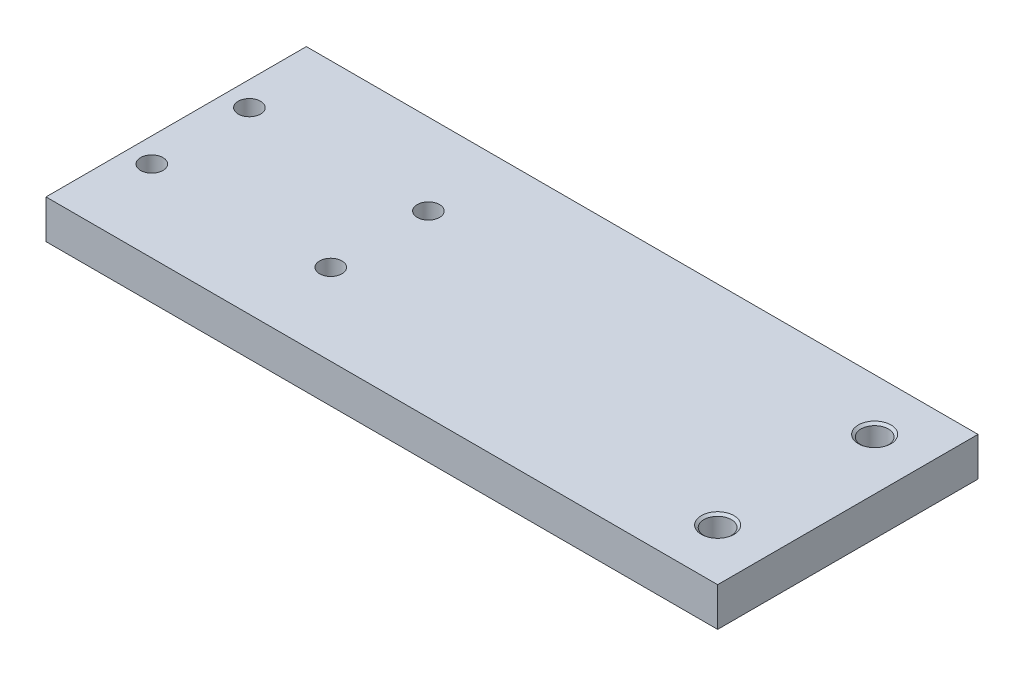
ISO-10303-21;
HEADER;
FILE_DESCRIPTION(('STEP AP214'),'2;1');
FILE_NAME('part.step','',(''),(''),'','','');
FILE_SCHEMA(('AUTOMOTIVE_DESIGN { 1 0 10303 214 1 1 1 1 }'));
ENDSEC;
DATA;
#1=APPLICATION_CONTEXT('core data for automotive mechanical design processes');
#2=APPLICATION_PROTOCOL_DEFINITION('international standard','automotive_design',2000,#1);
#3=PRODUCT_CONTEXT('',#1,'mechanical');
#4=PRODUCT('Part','Part','',(#3));
#5=PRODUCT_RELATED_PRODUCT_CATEGORY('part','',(#4));
#6=PRODUCT_DEFINITION_FORMATION('','',#4);
#7=PRODUCT_DEFINITION_CONTEXT('part definition',#1,'design');
#8=PRODUCT_DEFINITION('design','',#6,#7);
#9=PRODUCT_DEFINITION_SHAPE('','',#8);
#10=(LENGTH_UNIT() NAMED_UNIT(*) SI_UNIT(.MILLI.,.METRE.));
#11=(NAMED_UNIT(*) PLANE_ANGLE_UNIT() SI_UNIT($,.RADIAN.));
#12=(NAMED_UNIT(*) SI_UNIT($,.STERADIAN.) SOLID_ANGLE_UNIT());
#13=UNCERTAINTY_MEASURE_WITH_UNIT(LENGTH_MEASURE(1.E-05),#10,'distance_accuracy_value','');
#14=(GEOMETRIC_REPRESENTATION_CONTEXT(3) GLOBAL_UNCERTAINTY_ASSIGNED_CONTEXT((#13)) GLOBAL_UNIT_ASSIGNED_CONTEXT((#10,
#11,#12)) REPRESENTATION_CONTEXT('',''));
#15=CARTESIAN_POINT('',(0.,0.,0.));
#16=DIRECTION('',(0.,0.,1.));
#17=DIRECTION('',(1.,0.,0.));
#18=AXIS2_PLACEMENT_3D('',#15,#16,#17);
#19=CARTESIAN_POINT('',(0.,9.525,0.));
#20=DIRECTION('',(1.,0.,0.));
#21=DIRECTION('',(0.,0.,-1.));
#22=AXIS2_PLACEMENT_3D('',#19,#20,#21);
#23=PLANE('',#22);
#24=DIRECTION('',(0.,0.,1.));
#25=VECTOR('',#24,1.);
#26=CARTESIAN_POINT('',(0.,0.,0.));
#27=LINE('',#26,#25);
#28=CARTESIAN_POINT('',(0.,0.,-64.));
#29=VERTEX_POINT('',#28);
#30=CARTESIAN_POINT('',(0.,0.,0.));
#31=VERTEX_POINT('',#30);
#32=EDGE_CURVE('E111',#29,#31,#27,.T.);
#33=ORIENTED_EDGE('',*,*,#32,.T.);
#34=DIRECTION('',(0.,-1.,0.));
#35=VECTOR('',#34,1.);
#36=CARTESIAN_POINT('',(0.,9.525,0.));
#37=LINE('',#36,#35);
#38=CARTESIAN_POINT('',(0.,9.525,0.));
#39=VERTEX_POINT('',#38);
#40=EDGE_CURVE('E11',#39,#31,#37,.T.);
#41=ORIENTED_EDGE('',*,*,#40,.F.);
#42=DIRECTION('',(0.,0.,1.));
#43=VECTOR('',#42,1.);
#44=CARTESIAN_POINT('',(0.,9.525,0.));
#45=LINE('',#44,#43);
#46=CARTESIAN_POINT('',(0.,9.525,-64.));
#47=VERTEX_POINT('',#46);
#48=EDGE_CURVE('E95',#47,#39,#45,.T.);
#49=ORIENTED_EDGE('',*,*,#48,.F.);
#50=DIRECTION('',(0.,-1.,0.));
#51=VECTOR('',#50,1.);
#52=CARTESIAN_POINT('',(0.,9.525,-64.));
#53=LINE('',#52,#51);
#54=EDGE_CURVE('E107',#47,#29,#53,.T.);
#55=ORIENTED_EDGE('',*,*,#54,.T.);
#56=EDGE_LOOP('',(#33,#41,#49,#55));
#57=FACE_BOUND('',#56,.T.);
#58=ADVANCED_FACE('F43',(#57),#23,.F.);
#59=CARTESIAN_POINT('',(0.,9.525,0.));
#60=DIRECTION('',(0.,0.,-1.));
#61=DIRECTION('',(-1.,0.,0.));
#62=AXIS2_PLACEMENT_3D('',#59,#60,#61);
#63=PLANE('',#62);
#64=DIRECTION('',(1.,0.,0.));
#65=VECTOR('',#64,1.);
#66=CARTESIAN_POINT('',(0.,0.,0.));
#67=LINE('',#66,#65);
#68=CARTESIAN_POINT('',(165.1,0.,0.));
#69=VERTEX_POINT('',#68);
#70=EDGE_CURVE('E100',#31,#69,#67,.T.);
#71=ORIENTED_EDGE('',*,*,#70,.T.);
#72=DIRECTION('',(0.,-1.,0.));
#73=VECTOR('',#72,1.);
#74=CARTESIAN_POINT('',(165.1,9.525,0.));
#75=LINE('',#74,#73);
#76=CARTESIAN_POINT('',(165.1,9.525,0.));
#77=VERTEX_POINT('',#76);
#78=EDGE_CURVE('E52',#77,#69,#75,.T.);
#79=ORIENTED_EDGE('',*,*,#78,.F.);
#80=DIRECTION('',(1.,0.,0.));
#81=VECTOR('',#80,1.);
#82=CARTESIAN_POINT('',(0.,9.525,0.));
#83=LINE('',#82,#81);
#84=EDGE_CURVE('E90',#39,#77,#83,.T.);
#85=ORIENTED_EDGE('',*,*,#84,.F.);
#86=ORIENTED_EDGE('',*,*,#40,.T.);
#87=EDGE_LOOP('',(#71,#79,#85,#86));
#88=FACE_BOUND('',#87,.T.);
#89=ADVANCED_FACE('F99',(#88),#63,.F.);
#90=CARTESIAN_POINT('',(165.1,9.525,0.));
#91=DIRECTION('',(-1.,0.,0.));
#92=DIRECTION('',(0.,0.,1.));
#93=AXIS2_PLACEMENT_3D('',#90,#91,#92);
#94=PLANE('',#93);
#95=DIRECTION('',(0.,0.,-1.));
#96=VECTOR('',#95,1.);
#97=CARTESIAN_POINT('',(165.1,0.,0.));
#98=LINE('',#97,#96);
#99=CARTESIAN_POINT('',(165.1,0.,-64.));
#100=VERTEX_POINT('',#99);
#101=EDGE_CURVE('E77',#69,#100,#98,.T.);
#102=ORIENTED_EDGE('',*,*,#101,.T.);
#103=DIRECTION('',(0.,-1.,0.));
#104=VECTOR('',#103,1.);
#105=CARTESIAN_POINT('',(165.1,9.525,-64.));
#106=LINE('',#105,#104);
#107=CARTESIAN_POINT('',(165.1,9.525,-64.));
#108=VERTEX_POINT('',#107);
#109=EDGE_CURVE('E102',#108,#100,#106,.T.);
#110=ORIENTED_EDGE('',*,*,#109,.F.);
#111=DIRECTION('',(0.,0.,-1.));
#112=VECTOR('',#111,1.);
#113=CARTESIAN_POINT('',(165.1,9.525,0.));
#114=LINE('',#113,#112);
#115=EDGE_CURVE('E93',#77,#108,#114,.T.);
#116=ORIENTED_EDGE('',*,*,#115,.F.);
#117=ORIENTED_EDGE('',*,*,#78,.T.);
#118=EDGE_LOOP('',(#102,#110,#116,#117));
#119=FACE_BOUND('',#118,.T.);
#120=ADVANCED_FACE('F103',(#119),#94,.F.);
#121=CARTESIAN_POINT('',(0.,9.525,-64.));
#122=DIRECTION('',(0.,0.,1.));
#123=DIRECTION('',(1.,0.,0.));
#124=AXIS2_PLACEMENT_3D('',#121,#122,#123);
#125=PLANE('',#124);
#126=DIRECTION('',(-1.,0.,0.));
#127=VECTOR('',#126,1.);
#128=CARTESIAN_POINT('',(0.,0.,-64.));
#129=LINE('',#128,#127);
#130=EDGE_CURVE('E83',#100,#29,#129,.T.);
#131=ORIENTED_EDGE('',*,*,#130,.T.);
#132=ORIENTED_EDGE('',*,*,#54,.F.);
#133=DIRECTION('',(-1.,0.,0.));
#134=VECTOR('',#133,1.);
#135=CARTESIAN_POINT('',(0.,9.525,-64.));
#136=LINE('',#135,#134);
#137=EDGE_CURVE('E60',#108,#47,#136,.T.);
#138=ORIENTED_EDGE('',*,*,#137,.F.);
#139=ORIENTED_EDGE('',*,*,#109,.T.);
#140=EDGE_LOOP('',(#131,#132,#138,#139));
#141=FACE_BOUND('',#140,.T.);
#142=ADVANCED_FACE('F125',(#141),#125,.F.);
#143=CARTESIAN_POINT('',(0.,9.525,0.));
#144=DIRECTION('',(0.,-1.,0.));
#145=DIRECTION('',(0.,0.,-1.));
#146=AXIS2_PLACEMENT_3D('',#143,#144,#145);
#147=PLANE('',#146);
#148=CARTESIAN_POINT('',(6.,9.525,-44.));
#149=DIRECTION('',(0.,-1.,0.));
#150=DIRECTION('',(0.,0.,-1.));
#151=AXIS2_PLACEMENT_3D('',#148,#149,#150);
#152=CIRCLE('',#151,2.75);
#153=CARTESIAN_POINT('',(6.,9.525,-46.75));
#154=VERTEX_POINT('',#153);
#155=EDGE_CURVE('E215',#154,#154,#152,.T.);
#156=ORIENTED_EDGE('',*,*,#155,.T.);
#157=EDGE_LOOP('',(#156));
#158=FACE_BOUND('',#157,.T.);
#159=CARTESIAN_POINT('',(50.,9.525,-44.));
#160=DIRECTION('',(0.,-1.,0.));
#161=DIRECTION('',(0.,0.,-1.));
#162=AXIS2_PLACEMENT_3D('',#159,#160,#161);
#163=CIRCLE('',#162,2.75);
#164=CARTESIAN_POINT('',(50.,9.525,-46.75));
#165=VERTEX_POINT('',#164);
#166=EDGE_CURVE('E195',#165,#165,#163,.T.);
#167=ORIENTED_EDGE('',*,*,#166,.T.);
#168=EDGE_LOOP('',(#167));
#169=FACE_BOUND('',#168,.T.);
#170=CARTESIAN_POINT('',(50.,9.525,-20.));
#171=DIRECTION('',(0.,-1.,0.));
#172=DIRECTION('',(0.,0.,-1.));
#173=AXIS2_PLACEMENT_3D('',#170,#171,#172);
#174=CIRCLE('',#173,2.75);
#175=CARTESIAN_POINT('',(50.,9.525,-22.75));
#176=VERTEX_POINT('',#175);
#177=EDGE_CURVE('E175',#176,#176,#174,.T.);
#178=ORIENTED_EDGE('',*,*,#177,.T.);
#179=EDGE_LOOP('',(#178));
#180=FACE_BOUND('',#179,.T.);
#181=CARTESIAN_POINT('',(6.,9.525,-20.));
#182=DIRECTION('',(0.,-1.,0.));
#183=DIRECTION('',(0.,0.,-1.));
#184=AXIS2_PLACEMENT_3D('',#181,#182,#183);
#185=CIRCLE('',#184,2.75);
#186=CARTESIAN_POINT('',(6.,9.525,-22.75));
#187=VERTEX_POINT('',#186);
#188=EDGE_CURVE('E155',#187,#187,#185,.T.);
#189=ORIENTED_EDGE('',*,*,#188,.T.);
#190=EDGE_LOOP('',(#189));
#191=FACE_BOUND('',#190,.T.);
#192=CARTESIAN_POINT('',(152.4,9.525,-51.3));
#193=DIRECTION('',(0.,1.,0.));
#194=DIRECTION('',(0.,0.,1.));
#195=AXIS2_PLACEMENT_3D('',#192,#193,#194);
#196=CIRCLE('',#195,4.01319999999999);
#197=CARTESIAN_POINT('',(152.4,9.525,-47.2868));
#198=VERTEX_POINT('',#197);
#199=EDGE_CURVE('E151',#198,#198,#196,.T.);
#200=ORIENTED_EDGE('',*,*,#199,.F.);
#201=EDGE_LOOP('',(#200));
#202=FACE_BOUND('',#201,.T.);
#203=CARTESIAN_POINT('',(152.4,9.525,-12.7));
#204=DIRECTION('',(0.,1.,0.));
#205=DIRECTION('',(0.,0.,1.));
#206=AXIS2_PLACEMENT_3D('',#203,#204,#205);
#207=CIRCLE('',#206,4.01319999999999);
#208=CARTESIAN_POINT('',(152.4,9.525,-8.68680000000001));
#209=VERTEX_POINT('',#208);
#210=EDGE_CURVE('E139',#209,#209,#207,.T.);
#211=ORIENTED_EDGE('',*,*,#210,.F.);
#212=EDGE_LOOP('',(#211));
#213=FACE_BOUND('',#212,.T.);
#214=ORIENTED_EDGE('',*,*,#48,.T.);
#215=ORIENTED_EDGE('',*,*,#84,.T.);
#216=ORIENTED_EDGE('',*,*,#115,.T.);
#217=ORIENTED_EDGE('',*,*,#137,.T.);
#218=EDGE_LOOP('',(#214,#215,#216,#217));
#219=FACE_BOUND('',#218,.T.);
#220=ADVANCED_FACE('F91',(#158,#169,#180,#191,#202,#213,#219),#147,.F.);
#221=CARTESIAN_POINT('',(0.,0.,0.));
#222=DIRECTION('',(0.,-1.,0.));
#223=DIRECTION('',(0.,0.,-1.));
#224=AXIS2_PLACEMENT_3D('',#221,#222,#223);
#225=PLANE('',#224);
#226=CARTESIAN_POINT('',(6.,0.,-44.));
#227=DIRECTION('',(0.,-1.,0.));
#228=DIRECTION('',(0.,0.,-1.));
#229=AXIS2_PLACEMENT_3D('',#226,#227,#228);
#230=CIRCLE('',#229,5.025);
#231=CARTESIAN_POINT('',(6.,0.,-49.025));
#232=VERTEX_POINT('',#231);
#233=EDGE_CURVE('E231',#232,#232,#230,.T.);
#234=ORIENTED_EDGE('',*,*,#233,.F.);
#235=EDGE_LOOP('',(#234));
#236=FACE_BOUND('',#235,.T.);
#237=CARTESIAN_POINT('',(50.,0.,-44.));
#238=DIRECTION('',(0.,-1.,0.));
#239=DIRECTION('',(0.,0.,-1.));
#240=AXIS2_PLACEMENT_3D('',#237,#238,#239);
#241=CIRCLE('',#240,5.025);
#242=CARTESIAN_POINT('',(50.,0.,-49.025));
#243=VERTEX_POINT('',#242);
#244=EDGE_CURVE('E211',#243,#243,#241,.T.);
#245=ORIENTED_EDGE('',*,*,#244,.F.);
#246=EDGE_LOOP('',(#245));
#247=FACE_BOUND('',#246,.T.);
#248=CARTESIAN_POINT('',(50.,0.,-20.));
#249=DIRECTION('',(0.,-1.,0.));
#250=DIRECTION('',(0.,0.,-1.));
#251=AXIS2_PLACEMENT_3D('',#248,#249,#250);
#252=CIRCLE('',#251,5.025);
#253=CARTESIAN_POINT('',(50.,0.,-25.025));
#254=VERTEX_POINT('',#253);
#255=EDGE_CURVE('E191',#254,#254,#252,.T.);
#256=ORIENTED_EDGE('',*,*,#255,.F.);
#257=EDGE_LOOP('',(#256));
#258=FACE_BOUND('',#257,.T.);
#259=CARTESIAN_POINT('',(6.,0.,-20.));
#260=DIRECTION('',(0.,-1.,0.));
#261=DIRECTION('',(0.,0.,-1.));
#262=AXIS2_PLACEMENT_3D('',#259,#260,#261);
#263=CIRCLE('',#262,5.025);
#264=CARTESIAN_POINT('',(6.,0.,-25.025));
#265=VERTEX_POINT('',#264);
#266=EDGE_CURVE('E171',#265,#265,#263,.T.);
#267=ORIENTED_EDGE('',*,*,#266,.F.);
#268=EDGE_LOOP('',(#267));
#269=FACE_BOUND('',#268,.T.);
#270=CARTESIAN_POINT('',(152.4,0.,-51.3));
#271=DIRECTION('',(0.,1.,0.));
#272=DIRECTION('',(0.,0.,1.));
#273=AXIS2_PLACEMENT_3D('',#270,#271,#272);
#274=CIRCLE('',#273,3.3782);
#275=CARTESIAN_POINT('',(152.4,0.,-47.9218));
#276=VERTEX_POINT('',#275);
#277=EDGE_CURVE('E143',#276,#276,#274,.T.);
#278=ORIENTED_EDGE('',*,*,#277,.T.);
#279=EDGE_LOOP('',(#278));
#280=FACE_BOUND('',#279,.T.);
#281=CARTESIAN_POINT('',(152.4,0.,-12.7));
#282=DIRECTION('',(0.,1.,0.));
#283=DIRECTION('',(0.,0.,1.));
#284=AXIS2_PLACEMENT_3D('',#281,#282,#283);
#285=CIRCLE('',#284,3.3782);
#286=CARTESIAN_POINT('',(152.4,0.,-9.3218));
#287=VERTEX_POINT('',#286);
#288=EDGE_CURVE('E115',#287,#287,#285,.T.);
#289=ORIENTED_EDGE('',*,*,#288,.T.);
#290=EDGE_LOOP('',(#289));
#291=FACE_BOUND('',#290,.T.);
#292=ORIENTED_EDGE('',*,*,#32,.F.);
#293=ORIENTED_EDGE('',*,*,#130,.F.);
#294=ORIENTED_EDGE('',*,*,#101,.F.);
#295=ORIENTED_EDGE('',*,*,#70,.F.);
#296=EDGE_LOOP('',(#292,#293,#294,#295));
#297=FACE_BOUND('',#296,.T.);
#298=ADVANCED_FACE('F128',(#236,#247,#258,#269,#280,#291,#297),#225,.T.);
#299=CARTESIAN_POINT('',(152.4,9.525,-12.7));
#300=DIRECTION('',(0.,1.,0.));
#301=DIRECTION('',(0.,0.,1.));
#302=AXIS2_PLACEMENT_3D('',#299,#300,#301);
#303=CYLINDRICAL_SURFACE('',#302,3.3782);
#304=ORIENTED_EDGE('',*,*,#288,.F.);
#305=EDGE_LOOP('',(#304));
#306=FACE_BOUND('',#305,.T.);
#307=CARTESIAN_POINT('',(152.4,8.99217173420243,-12.7));
#308=DIRECTION('',(0.,1.,0.));
#309=DIRECTION('',(0.,0.,1.));
#310=AXIS2_PLACEMENT_3D('',#307,#308,#309);
#311=CIRCLE('',#310,3.3782);
#312=CARTESIAN_POINT('',(152.4,8.99217173420243,-9.3218));
#313=VERTEX_POINT('',#312);
#314=EDGE_CURVE('E135',#313,#313,#311,.T.);
#315=ORIENTED_EDGE('',*,*,#314,.T.);
#316=EDGE_LOOP('',(#315));
#317=FACE_BOUND('',#316,.T.);
#318=ADVANCED_FACE('F240',(#306,#317),#303,.F.);
#319=CARTESIAN_POINT('',(152.4,9.525,-12.7));
#320=DIRECTION('',(0.,1.,0.));
#321=DIRECTION('',(0.,0.,1.));
#322=AXIS2_PLACEMENT_3D('',#319,#320,#321);
#323=CONICAL_SURFACE('',#322,4.01319999999999,0.872664625997161);
#324=ORIENTED_EDGE('',*,*,#314,.F.);
#325=EDGE_LOOP('',(#324));
#326=FACE_BOUND('',#325,.T.);
#327=ORIENTED_EDGE('',*,*,#210,.T.);
#328=EDGE_LOOP('',(#327));
#329=FACE_BOUND('',#328,.T.);
#330=ADVANCED_FACE('F254',(#326,#329),#323,.F.);
#331=CARTESIAN_POINT('',(152.4,9.525,-51.3));
#332=DIRECTION('',(0.,1.,0.));
#333=DIRECTION('',(0.,0.,1.));
#334=AXIS2_PLACEMENT_3D('',#331,#332,#333);
#335=CYLINDRICAL_SURFACE('',#334,3.3782);
#336=ORIENTED_EDGE('',*,*,#277,.F.);
#337=EDGE_LOOP('',(#336));
#338=FACE_BOUND('',#337,.T.);
#339=CARTESIAN_POINT('',(152.4,8.99217173420243,-51.3));
#340=DIRECTION('',(0.,1.,0.));
#341=DIRECTION('',(0.,0.,1.));
#342=AXIS2_PLACEMENT_3D('',#339,#340,#341);
#343=CIRCLE('',#342,3.3782);
#344=CARTESIAN_POINT('',(152.4,8.99217173420243,-47.9218));
#345=VERTEX_POINT('',#344);
#346=EDGE_CURVE('E147',#345,#345,#343,.T.);
#347=ORIENTED_EDGE('',*,*,#346,.T.);
#348=EDGE_LOOP('',(#347));
#349=FACE_BOUND('',#348,.T.);
#350=ADVANCED_FACE('F260',(#338,#349),#335,.F.);
#351=CARTESIAN_POINT('',(152.4,9.525,-51.3));
#352=DIRECTION('',(0.,1.,0.));
#353=DIRECTION('',(0.,0.,1.));
#354=AXIS2_PLACEMENT_3D('',#351,#352,#353);
#355=CONICAL_SURFACE('',#354,4.01319999999999,0.872664625997161);
#356=ORIENTED_EDGE('',*,*,#346,.F.);
#357=EDGE_LOOP('',(#356));
#358=FACE_BOUND('',#357,.T.);
#359=ORIENTED_EDGE('',*,*,#199,.T.);
#360=EDGE_LOOP('',(#359));
#361=FACE_BOUND('',#360,.T.);
#362=ADVANCED_FACE('F312',(#358,#361),#355,.F.);
#363=CARTESIAN_POINT('',(6.,0.,-20.));
#364=DIRECTION('',(0.,-1.,0.));
#365=DIRECTION('',(0.,0.,-1.));
#366=AXIS2_PLACEMENT_3D('',#363,#364,#365);
#367=CYLINDRICAL_SURFACE('',#366,2.75);
#368=ORIENTED_EDGE('',*,*,#188,.F.);
#369=EDGE_LOOP('',(#368));
#370=FACE_BOUND('',#369,.T.);
#371=CARTESIAN_POINT('',(6.,5.,-20.));
#372=DIRECTION('',(0.,-1.,0.));
#373=DIRECTION('',(0.,0.,-1.));
#374=AXIS2_PLACEMENT_3D('',#371,#372,#373);
#375=CIRCLE('',#374,2.75);
#376=CARTESIAN_POINT('',(6.,5.,-22.75));
#377=VERTEX_POINT('',#376);
#378=EDGE_CURVE('E159',#377,#377,#375,.T.);
#379=ORIENTED_EDGE('',*,*,#378,.T.);
#380=EDGE_LOOP('',(#379));
#381=FACE_BOUND('',#380,.T.);
#382=ADVANCED_FACE('F322',(#370,#381),#367,.F.);
#383=CARTESIAN_POINT('',(11.,5.,-20.));
#384=DIRECTION('',(0.,1.,0.));
#385=DIRECTION('',(0.,0.,1.));
#386=AXIS2_PLACEMENT_3D('',#383,#384,#385);
#387=PLANE('',#386);
#388=ORIENTED_EDGE('',*,*,#378,.F.);
#389=EDGE_LOOP('',(#388));
#390=FACE_BOUND('',#389,.T.);
#391=CARTESIAN_POINT('',(6.,5.,-20.));
#392=DIRECTION('',(0.,-1.,0.));
#393=DIRECTION('',(0.,0.,-1.));
#394=AXIS2_PLACEMENT_3D('',#391,#392,#393);
#395=CIRCLE('',#394,5.);
#396=CARTESIAN_POINT('',(6.,5.,-25.));
#397=VERTEX_POINT('',#396);
#398=EDGE_CURVE('E163',#397,#397,#395,.T.);
#399=ORIENTED_EDGE('',*,*,#398,.T.);
#400=EDGE_LOOP('',(#399));
#401=FACE_BOUND('',#400,.T.);
#402=ADVANCED_FACE('F344',(#390,#401),#387,.F.);
#403=CARTESIAN_POINT('',(6.,0.,-20.));
#404=DIRECTION('',(0.,-1.,0.));
#405=DIRECTION('',(0.,0.,-1.));
#406=AXIS2_PLACEMENT_3D('',#403,#404,#405);
#407=CYLINDRICAL_SURFACE('',#406,5.);
#408=ORIENTED_EDGE('',*,*,#398,.F.);
#409=EDGE_LOOP('',(#408));
#410=FACE_BOUND('',#409,.T.);
#411=CARTESIAN_POINT('',(6.,0.0209774907794336,-20.));
#412=DIRECTION('',(0.,-1.,0.));
#413=DIRECTION('',(0.,0.,-1.));
#414=AXIS2_PLACEMENT_3D('',#411,#412,#413);
#415=CIRCLE('',#414,5.);
#416=CARTESIAN_POINT('',(6.,0.0209774907794336,-25.));
#417=VERTEX_POINT('',#416);
#418=EDGE_CURVE('E167',#417,#417,#415,.T.);
#419=ORIENTED_EDGE('',*,*,#418,.T.);
#420=EDGE_LOOP('',(#419));
#421=FACE_BOUND('',#420,.T.);
#422=ADVANCED_FACE('F355',(#410,#421),#407,.F.);
#423=CARTESIAN_POINT('',(6.,0.,-20.));
#424=DIRECTION('',(0.,-1.,0.));
#425=DIRECTION('',(0.,0.,-1.));
#426=AXIS2_PLACEMENT_3D('',#423,#424,#425);
#427=CONICAL_SURFACE('',#426,5.025,0.872664625997141);
#428=ORIENTED_EDGE('',*,*,#418,.F.);
#429=EDGE_LOOP('',(#428));
#430=FACE_BOUND('',#429,.T.);
#431=ORIENTED_EDGE('',*,*,#266,.T.);
#432=EDGE_LOOP('',(#431));
#433=FACE_BOUND('',#432,.T.);
#434=ADVANCED_FACE('F366',(#430,#433),#427,.F.);
#435=CARTESIAN_POINT('',(50.,0.,-20.));
#436=DIRECTION('',(0.,-1.,0.));
#437=DIRECTION('',(0.,0.,-1.));
#438=AXIS2_PLACEMENT_3D('',#435,#436,#437);
#439=CYLINDRICAL_SURFACE('',#438,2.75);
#440=ORIENTED_EDGE('',*,*,#177,.F.);
#441=EDGE_LOOP('',(#440));
#442=FACE_BOUND('',#441,.T.);
#443=CARTESIAN_POINT('',(50.,5.,-20.));
#444=DIRECTION('',(0.,-1.,0.));
#445=DIRECTION('',(0.,0.,-1.));
#446=AXIS2_PLACEMENT_3D('',#443,#444,#445);
#447=CIRCLE('',#446,2.75);
#448=CARTESIAN_POINT('',(50.,5.,-22.75));
#449=VERTEX_POINT('',#448);
#450=EDGE_CURVE('E179',#449,#449,#447,.T.);
#451=ORIENTED_EDGE('',*,*,#450,.T.);
#452=EDGE_LOOP('',(#451));
#453=FACE_BOUND('',#452,.T.);
#454=ADVANCED_FACE('F377',(#442,#453),#439,.F.);
#455=CARTESIAN_POINT('',(55.,5.,-20.));
#456=DIRECTION('',(0.,1.,0.));
#457=DIRECTION('',(0.,0.,1.));
#458=AXIS2_PLACEMENT_3D('',#455,#456,#457);
#459=PLANE('',#458);
#460=ORIENTED_EDGE('',*,*,#450,.F.);
#461=EDGE_LOOP('',(#460));
#462=FACE_BOUND('',#461,.T.);
#463=CARTESIAN_POINT('',(50.,5.,-20.));
#464=DIRECTION('',(0.,-1.,0.));
#465=DIRECTION('',(0.,0.,-1.));
#466=AXIS2_PLACEMENT_3D('',#463,#464,#465);
#467=CIRCLE('',#466,5.);
#468=CARTESIAN_POINT('',(50.,5.,-25.));
#469=VERTEX_POINT('',#468);
#470=EDGE_CURVE('E183',#469,#469,#467,.T.);
#471=ORIENTED_EDGE('',*,*,#470,.T.);
#472=EDGE_LOOP('',(#471));
#473=FACE_BOUND('',#472,.T.);
#474=ADVANCED_FACE('F388',(#462,#473),#459,.F.);
#475=CARTESIAN_POINT('',(50.,0.,-20.));
#476=DIRECTION('',(0.,-1.,0.));
#477=DIRECTION('',(0.,0.,-1.));
#478=AXIS2_PLACEMENT_3D('',#475,#476,#477);
#479=CYLINDRICAL_SURFACE('',#478,5.);
#480=ORIENTED_EDGE('',*,*,#470,.F.);
#481=EDGE_LOOP('',(#480));
#482=FACE_BOUND('',#481,.T.);
#483=CARTESIAN_POINT('',(50.,0.0209774907794336,-20.));
#484=DIRECTION('',(0.,-1.,0.));
#485=DIRECTION('',(0.,0.,-1.));
#486=AXIS2_PLACEMENT_3D('',#483,#484,#485);
#487=CIRCLE('',#486,5.);
#488=CARTESIAN_POINT('',(50.,0.0209774907794336,-25.));
#489=VERTEX_POINT('',#488);
#490=EDGE_CURVE('E187',#489,#489,#487,.T.);
#491=ORIENTED_EDGE('',*,*,#490,.T.);
#492=EDGE_LOOP('',(#491));
#493=FACE_BOUND('',#492,.T.);
#494=ADVANCED_FACE('F399',(#482,#493),#479,.F.);
#495=CARTESIAN_POINT('',(50.,0.,-20.));
#496=DIRECTION('',(0.,-1.,0.));
#497=DIRECTION('',(0.,0.,-1.));
#498=AXIS2_PLACEMENT_3D('',#495,#496,#497);
#499=CONICAL_SURFACE('',#498,5.025,0.872664625997209);
#500=ORIENTED_EDGE('',*,*,#490,.F.);
#501=EDGE_LOOP('',(#500));
#502=FACE_BOUND('',#501,.T.);
#503=ORIENTED_EDGE('',*,*,#255,.T.);
#504=EDGE_LOOP('',(#503));
#505=FACE_BOUND('',#504,.T.);
#506=ADVANCED_FACE('F410',(#502,#505),#499,.F.);
#507=CARTESIAN_POINT('',(50.,0.,-44.));
#508=DIRECTION('',(0.,-1.,0.));
#509=DIRECTION('',(0.,0.,-1.));
#510=AXIS2_PLACEMENT_3D('',#507,#508,#509);
#511=CYLINDRICAL_SURFACE('',#510,2.75);
#512=ORIENTED_EDGE('',*,*,#166,.F.);
#513=EDGE_LOOP('',(#512));
#514=FACE_BOUND('',#513,.T.);
#515=CARTESIAN_POINT('',(50.,5.,-44.));
#516=DIRECTION('',(0.,-1.,0.));
#517=DIRECTION('',(0.,0.,-1.));
#518=AXIS2_PLACEMENT_3D('',#515,#516,#517);
#519=CIRCLE('',#518,2.75);
#520=CARTESIAN_POINT('',(50.,5.,-46.75));
#521=VERTEX_POINT('',#520);
#522=EDGE_CURVE('E199',#521,#521,#519,.T.);
#523=ORIENTED_EDGE('',*,*,#522,.T.);
#524=EDGE_LOOP('',(#523));
#525=FACE_BOUND('',#524,.T.);
#526=ADVANCED_FACE('F421',(#514,#525),#511,.F.);
#527=CARTESIAN_POINT('',(55.,5.,-44.));
#528=DIRECTION('',(0.,1.,0.));
#529=DIRECTION('',(0.,0.,1.));
#530=AXIS2_PLACEMENT_3D('',#527,#528,#529);
#531=PLANE('',#530);
#532=ORIENTED_EDGE('',*,*,#522,.F.);
#533=EDGE_LOOP('',(#532));
#534=FACE_BOUND('',#533,.T.);
#535=CARTESIAN_POINT('',(50.,5.,-44.));
#536=DIRECTION('',(0.,-1.,0.));
#537=DIRECTION('',(0.,0.,-1.));
#538=AXIS2_PLACEMENT_3D('',#535,#536,#537);
#539=CIRCLE('',#538,5.);
#540=CARTESIAN_POINT('',(50.,5.,-49.));
#541=VERTEX_POINT('',#540);
#542=EDGE_CURVE('E203',#541,#541,#539,.T.);
#543=ORIENTED_EDGE('',*,*,#542,.T.);
#544=EDGE_LOOP('',(#543));
#545=FACE_BOUND('',#544,.T.);
#546=ADVANCED_FACE('F432',(#534,#545),#531,.F.);
#547=CARTESIAN_POINT('',(50.,0.,-44.));
#548=DIRECTION('',(0.,-1.,0.));
#549=DIRECTION('',(0.,0.,-1.));
#550=AXIS2_PLACEMENT_3D('',#547,#548,#549);
#551=CYLINDRICAL_SURFACE('',#550,5.);
#552=ORIENTED_EDGE('',*,*,#542,.F.);
#553=EDGE_LOOP('',(#552));
#554=FACE_BOUND('',#553,.T.);
#555=CARTESIAN_POINT('',(50.,0.0209774907794336,-44.));
#556=DIRECTION('',(0.,-1.,0.));
#557=DIRECTION('',(0.,0.,-1.));
#558=AXIS2_PLACEMENT_3D('',#555,#556,#557);
#559=CIRCLE('',#558,5.);
#560=CARTESIAN_POINT('',(50.,0.0209774907794336,-49.));
#561=VERTEX_POINT('',#560);
#562=EDGE_CURVE('E207',#561,#561,#559,.T.);
#563=ORIENTED_EDGE('',*,*,#562,.T.);
#564=EDGE_LOOP('',(#563));
#565=FACE_BOUND('',#564,.T.);
#566=ADVANCED_FACE('F443',(#554,#565),#551,.F.);
#567=CARTESIAN_POINT('',(50.,0.,-44.));
#568=DIRECTION('',(0.,-1.,0.));
#569=DIRECTION('',(0.,0.,-1.));
#570=AXIS2_PLACEMENT_3D('',#567,#568,#569);
#571=CONICAL_SURFACE('',#570,5.025,0.872664625997209);
#572=ORIENTED_EDGE('',*,*,#562,.F.);
#573=EDGE_LOOP('',(#572));
#574=FACE_BOUND('',#573,.T.);
#575=ORIENTED_EDGE('',*,*,#244,.T.);
#576=EDGE_LOOP('',(#575));
#577=FACE_BOUND('',#576,.T.);
#578=ADVANCED_FACE('F454',(#574,#577),#571,.F.);
#579=CARTESIAN_POINT('',(6.,0.,-44.));
#580=DIRECTION('',(0.,-1.,0.));
#581=DIRECTION('',(0.,0.,-1.));
#582=AXIS2_PLACEMENT_3D('',#579,#580,#581);
#583=CYLINDRICAL_SURFACE('',#582,2.75);
#584=ORIENTED_EDGE('',*,*,#155,.F.);
#585=EDGE_LOOP('',(#584));
#586=FACE_BOUND('',#585,.T.);
#587=CARTESIAN_POINT('',(6.,5.,-44.));
#588=DIRECTION('',(0.,-1.,0.));
#589=DIRECTION('',(0.,0.,-1.));
#590=AXIS2_PLACEMENT_3D('',#587,#588,#589);
#591=CIRCLE('',#590,2.75);
#592=CARTESIAN_POINT('',(6.,5.,-46.75));
#593=VERTEX_POINT('',#592);
#594=EDGE_CURVE('E219',#593,#593,#591,.T.);
#595=ORIENTED_EDGE('',*,*,#594,.T.);
#596=EDGE_LOOP('',(#595));
#597=FACE_BOUND('',#596,.T.);
#598=ADVANCED_FACE('F465',(#586,#597),#583,.F.);
#599=CARTESIAN_POINT('',(11.,5.,-44.));
#600=DIRECTION('',(0.,1.,0.));
#601=DIRECTION('',(0.,0.,1.));
#602=AXIS2_PLACEMENT_3D('',#599,#600,#601);
#603=PLANE('',#602);
#604=ORIENTED_EDGE('',*,*,#594,.F.);
#605=EDGE_LOOP('',(#604));
#606=FACE_BOUND('',#605,.T.);
#607=CARTESIAN_POINT('',(6.,5.,-44.));
#608=DIRECTION('',(0.,-1.,0.));
#609=DIRECTION('',(0.,0.,-1.));
#610=AXIS2_PLACEMENT_3D('',#607,#608,#609);
#611=CIRCLE('',#610,5.);
#612=CARTESIAN_POINT('',(6.,5.,-49.));
#613=VERTEX_POINT('',#612);
#614=EDGE_CURVE('E223',#613,#613,#611,.T.);
#615=ORIENTED_EDGE('',*,*,#614,.T.);
#616=EDGE_LOOP('',(#615));
#617=FACE_BOUND('',#616,.T.);
#618=ADVANCED_FACE('F476',(#606,#617),#603,.F.);
#619=CARTESIAN_POINT('',(6.,0.,-44.));
#620=DIRECTION('',(0.,-1.,0.));
#621=DIRECTION('',(0.,0.,-1.));
#622=AXIS2_PLACEMENT_3D('',#619,#620,#621);
#623=CYLINDRICAL_SURFACE('',#622,5.);
#624=ORIENTED_EDGE('',*,*,#614,.F.);
#625=EDGE_LOOP('',(#624));
#626=FACE_BOUND('',#625,.T.);
#627=CARTESIAN_POINT('',(6.,0.0209774907794336,-44.));
#628=DIRECTION('',(0.,-1.,0.));
#629=DIRECTION('',(0.,0.,-1.));
#630=AXIS2_PLACEMENT_3D('',#627,#628,#629);
#631=CIRCLE('',#630,5.);
#632=CARTESIAN_POINT('',(6.,0.0209774907794336,-49.));
#633=VERTEX_POINT('',#632);
#634=EDGE_CURVE('E227',#633,#633,#631,.T.);
#635=ORIENTED_EDGE('',*,*,#634,.T.);
#636=EDGE_LOOP('',(#635));
#637=FACE_BOUND('',#636,.T.);
#638=ADVANCED_FACE('F487',(#626,#637),#623,.F.);
#639=CARTESIAN_POINT('',(6.,0.,-44.));
#640=DIRECTION('',(0.,-1.,0.));
#641=DIRECTION('',(0.,0.,-1.));
#642=AXIS2_PLACEMENT_3D('',#639,#640,#641);
#643=CONICAL_SURFACE('',#642,5.025,0.872664625997141);
#644=ORIENTED_EDGE('',*,*,#634,.F.);
#645=EDGE_LOOP('',(#644));
#646=FACE_BOUND('',#645,.T.);
#647=ORIENTED_EDGE('',*,*,#233,.T.);
#648=EDGE_LOOP('',(#647));
#649=FACE_BOUND('',#648,.T.);
#650=ADVANCED_FACE('F236',(#646,#649),#643,.F.);
#651=CLOSED_SHELL('',(#58,#89,#120,#142,#220,#298,#318,#330,#350,#362,#382,#402,#422,#434,#454,
#474,#494,#506,#526,#546,#566,#578,#598,#618,#638,#650));
#652=MANIFOLD_SOLID_BREP('B2',#651);
#653=ADVANCED_BREP_SHAPE_REPRESENTATION('',(#18,#652),#14);
#654=SHAPE_DEFINITION_REPRESENTATION(#9,#653);
ENDSEC;
END-ISO-10303-21;
